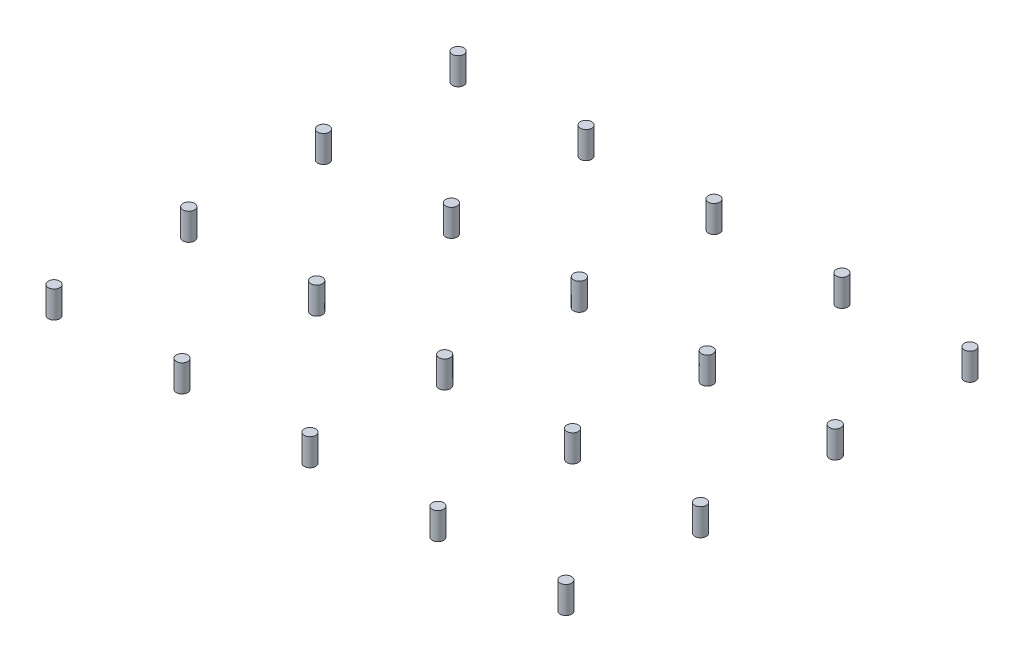
ISO-10303-21;
HEADER;
FILE_DESCRIPTION(('STEP AP214'),'2;1');
FILE_NAME('part.step','',(''),(''),'','','');
FILE_SCHEMA(('AUTOMOTIVE_DESIGN { 1 0 10303 214 1 1 1 1 }'));
ENDSEC;
DATA;
#1=APPLICATION_CONTEXT('core data for automotive mechanical design processes');
#2=APPLICATION_PROTOCOL_DEFINITION('international standard','automotive_design',2000,#1);
#3=PRODUCT_CONTEXT('',#1,'mechanical');
#4=PRODUCT('Part','Part','',(#3));
#5=PRODUCT_RELATED_PRODUCT_CATEGORY('part','',(#4));
#6=PRODUCT_DEFINITION_FORMATION('','',#4);
#7=PRODUCT_DEFINITION_CONTEXT('part definition',#1,'design');
#8=PRODUCT_DEFINITION('design','',#6,#7);
#9=PRODUCT_DEFINITION_SHAPE('','',#8);
#10=(LENGTH_UNIT() NAMED_UNIT(*) SI_UNIT(.MILLI.,.METRE.));
#11=(NAMED_UNIT(*) PLANE_ANGLE_UNIT() SI_UNIT($,.RADIAN.));
#12=(NAMED_UNIT(*) SI_UNIT($,.STERADIAN.) SOLID_ANGLE_UNIT());
#13=UNCERTAINTY_MEASURE_WITH_UNIT(LENGTH_MEASURE(1.E-05),#10,'distance_accuracy_value','');
#14=(GEOMETRIC_REPRESENTATION_CONTEXT(3) GLOBAL_UNCERTAINTY_ASSIGNED_CONTEXT((#13)) GLOBAL_UNIT_ASSIGNED_CONTEXT((#10,
#11,#12)) REPRESENTATION_CONTEXT('',''));
#15=CARTESIAN_POINT('',(0.,0.,0.));
#16=DIRECTION('',(0.,0.,1.));
#17=DIRECTION('',(1.,0.,0.));
#18=AXIS2_PLACEMENT_3D('',#15,#16,#17);
#19=CARTESIAN_POINT('',(-39.0000000000001,2.,-35.));
#20=DIRECTION('',(0.,-1.,0.));
#21=DIRECTION('',(0.,0.,-1.));
#22=AXIS2_PLACEMENT_3D('',#19,#20,#21);
#23=CYLINDRICAL_SURFACE('',#22,0.425000000000004);
#24=CARTESIAN_POINT('',(-39.0000000000001,2.,-35.));
#25=DIRECTION('',(0.,1.,0.));
#26=DIRECTION('',(0.,0.,1.));
#27=AXIS2_PLACEMENT_3D('',#24,#25,#26);
#28=CIRCLE('',#27,0.425000000000004);
#29=CARTESIAN_POINT('',(-39.0000000000001,2.,-34.575));
#30=VERTEX_POINT('',#29);
#31=EDGE_CURVE('E53',#30,#30,#28,.T.);
#32=ORIENTED_EDGE('',*,*,#31,.F.);
#33=EDGE_LOOP('',(#32));
#34=FACE_BOUND('',#33,.T.);
#35=CARTESIAN_POINT('',(-39.0000000000001,0.,-35.));
#36=DIRECTION('',(0.,1.,0.));
#37=DIRECTION('',(0.,0.,1.));
#38=AXIS2_PLACEMENT_3D('',#35,#36,#37);
#39=CIRCLE('',#38,0.425000000000004);
#40=CARTESIAN_POINT('',(-39.0000000000001,0.,-34.575));
#41=VERTEX_POINT('',#40);
#42=EDGE_CURVE('E11',#41,#41,#39,.T.);
#43=ORIENTED_EDGE('',*,*,#42,.T.);
#44=EDGE_LOOP('',(#43));
#45=FACE_BOUND('',#44,.T.);
#46=ADVANCED_FACE('F49',(#34,#45),#23,.T.);
#47=CARTESIAN_POINT('',(-39.0000000000001,2.,-35.));
#48=DIRECTION('',(0.,1.,0.));
#49=DIRECTION('',(0.,0.,1.));
#50=AXIS2_PLACEMENT_3D('',#47,#48,#49);
#51=PLANE('',#50);
#52=ORIENTED_EDGE('',*,*,#31,.T.);
#53=EDGE_LOOP('',(#52));
#54=FACE_BOUND('',#53,.T.);
#55=ADVANCED_FACE('F51',(#54),#51,.T.);
#56=CARTESIAN_POINT('',(-39.0000000000001,0.,-35.));
#57=DIRECTION('',(0.,1.,0.));
#58=DIRECTION('',(0.,0.,1.));
#59=AXIS2_PLACEMENT_3D('',#56,#57,#58);
#60=PLANE('',#59);
#61=ORIENTED_EDGE('',*,*,#42,.F.);
#62=EDGE_LOOP('',(#61));
#63=FACE_BOUND('',#62,.T.);
#64=ADVANCED_FACE('F68',(#63),#60,.F.);
#65=CLOSED_SHELL('',(#46,#55,#64));
#66=MANIFOLD_SOLID_BREP('B2',#65);
#67=CARTESIAN_POINT('',(-39.0000000000001,2.,-25.));
#68=DIRECTION('',(0.,-1.,0.));
#69=DIRECTION('',(0.,0.,-1.));
#70=AXIS2_PLACEMENT_3D('',#67,#68,#69);
#71=CYLINDRICAL_SURFACE('',#70,0.425000000000004);
#72=CARTESIAN_POINT('',(-39.0000000000001,2.,-25.));
#73=DIRECTION('',(0.,1.,0.));
#74=DIRECTION('',(0.,0.,1.));
#75=AXIS2_PLACEMENT_3D('',#72,#73,#74);
#76=CIRCLE('',#75,0.425000000000004);
#77=CARTESIAN_POINT('',(-39.0000000000001,2.,-24.575));
#78=VERTEX_POINT('',#77);
#79=EDGE_CURVE('E107',#78,#78,#76,.T.);
#80=ORIENTED_EDGE('',*,*,#79,.F.);
#81=EDGE_LOOP('',(#80));
#82=FACE_BOUND('',#81,.T.);
#83=CARTESIAN_POINT('',(-39.0000000000001,0.,-25.));
#84=DIRECTION('',(0.,1.,0.));
#85=DIRECTION('',(0.,0.,1.));
#86=AXIS2_PLACEMENT_3D('',#83,#84,#85);
#87=CIRCLE('',#86,0.425000000000004);
#88=CARTESIAN_POINT('',(-39.0000000000001,0.,-24.575));
#89=VERTEX_POINT('',#88);
#90=EDGE_CURVE('E48',#89,#89,#87,.T.);
#91=ORIENTED_EDGE('',*,*,#90,.T.);
#92=EDGE_LOOP('',(#91));
#93=FACE_BOUND('',#92,.T.);
#94=ADVANCED_FACE('F103',(#82,#93),#71,.T.);
#95=CARTESIAN_POINT('',(-39.0000000000001,2.,-25.));
#96=DIRECTION('',(0.,1.,0.));
#97=DIRECTION('',(0.,0.,1.));
#98=AXIS2_PLACEMENT_3D('',#95,#96,#97);
#99=PLANE('',#98);
#100=ORIENTED_EDGE('',*,*,#79,.T.);
#101=EDGE_LOOP('',(#100));
#102=FACE_BOUND('',#101,.T.);
#103=ADVANCED_FACE('F105',(#102),#99,.T.);
#104=CARTESIAN_POINT('',(-39.0000000000001,0.,-25.));
#105=DIRECTION('',(0.,1.,0.));
#106=DIRECTION('',(0.,0.,1.));
#107=AXIS2_PLACEMENT_3D('',#104,#105,#106);
#108=PLANE('',#107);
#109=ORIENTED_EDGE('',*,*,#90,.F.);
#110=EDGE_LOOP('',(#109));
#111=FACE_BOUND('',#110,.T.);
#112=ADVANCED_FACE('F122',(#111),#108,.F.);
#113=CLOSED_SHELL('',(#94,#103,#112));
#114=MANIFOLD_SOLID_BREP('B6',#113);
#115=CARTESIAN_POINT('',(-39.,2.,-15.));
#116=DIRECTION('',(0.,-1.,0.));
#117=DIRECTION('',(0.,0.,-1.));
#118=AXIS2_PLACEMENT_3D('',#115,#116,#117);
#119=CYLINDRICAL_SURFACE('',#118,0.425000000000003);
#120=CARTESIAN_POINT('',(-39.,2.,-15.));
#121=DIRECTION('',(0.,1.,0.));
#122=DIRECTION('',(0.,0.,1.));
#123=AXIS2_PLACEMENT_3D('',#120,#121,#122);
#124=CIRCLE('',#123,0.425000000000003);
#125=CARTESIAN_POINT('',(-39.,2.,-14.575));
#126=VERTEX_POINT('',#125);
#127=EDGE_CURVE('E161',#126,#126,#124,.T.);
#128=ORIENTED_EDGE('',*,*,#127,.F.);
#129=EDGE_LOOP('',(#128));
#130=FACE_BOUND('',#129,.T.);
#131=CARTESIAN_POINT('',(-39.,0.,-15.));
#132=DIRECTION('',(0.,1.,0.));
#133=DIRECTION('',(0.,0.,1.));
#134=AXIS2_PLACEMENT_3D('',#131,#132,#133);
#135=CIRCLE('',#134,0.425000000000003);
#136=CARTESIAN_POINT('',(-39.,0.,-14.575));
#137=VERTEX_POINT('',#136);
#138=EDGE_CURVE('E102',#137,#137,#135,.T.);
#139=ORIENTED_EDGE('',*,*,#138,.T.);
#140=EDGE_LOOP('',(#139));
#141=FACE_BOUND('',#140,.T.);
#142=ADVANCED_FACE('F157',(#130,#141),#119,.T.);
#143=CARTESIAN_POINT('',(-39.,2.,-15.));
#144=DIRECTION('',(0.,1.,0.));
#145=DIRECTION('',(0.,0.,1.));
#146=AXIS2_PLACEMENT_3D('',#143,#144,#145);
#147=PLANE('',#146);
#148=ORIENTED_EDGE('',*,*,#127,.T.);
#149=EDGE_LOOP('',(#148));
#150=FACE_BOUND('',#149,.T.);
#151=ADVANCED_FACE('F159',(#150),#147,.T.);
#152=CARTESIAN_POINT('',(-39.,0.,-15.));
#153=DIRECTION('',(0.,1.,0.));
#154=DIRECTION('',(0.,0.,1.));
#155=AXIS2_PLACEMENT_3D('',#152,#153,#154);
#156=PLANE('',#155);
#157=ORIENTED_EDGE('',*,*,#138,.F.);
#158=EDGE_LOOP('',(#157));
#159=FACE_BOUND('',#158,.T.);
#160=ADVANCED_FACE('F176',(#159),#156,.F.);
#161=CLOSED_SHELL('',(#142,#151,#160));
#162=MANIFOLD_SOLID_BREP('B43',#161);
#163=CARTESIAN_POINT('',(-1.00000000000011,2.,-35.));
#164=DIRECTION('',(0.,-1.,0.));
#165=DIRECTION('',(0.,0.,-1.));
#166=AXIS2_PLACEMENT_3D('',#163,#164,#165);
#167=CYLINDRICAL_SURFACE('',#166,0.425000000000004);
#168=CARTESIAN_POINT('',(-1.00000000000011,2.,-35.));
#169=DIRECTION('',(0.,1.,0.));
#170=DIRECTION('',(0.,0.,1.));
#171=AXIS2_PLACEMENT_3D('',#168,#169,#170);
#172=CIRCLE('',#171,0.425000000000004);
#173=CARTESIAN_POINT('',(-1.00000000000011,2.,-34.575));
#174=VERTEX_POINT('',#173);
#175=EDGE_CURVE('E215',#174,#174,#172,.T.);
#176=ORIENTED_EDGE('',*,*,#175,.F.);
#177=EDGE_LOOP('',(#176));
#178=FACE_BOUND('',#177,.T.);
#179=CARTESIAN_POINT('',(-1.00000000000011,0.,-35.));
#180=DIRECTION('',(0.,1.,0.));
#181=DIRECTION('',(0.,0.,1.));
#182=AXIS2_PLACEMENT_3D('',#179,#180,#181);
#183=CIRCLE('',#182,0.425000000000004);
#184=CARTESIAN_POINT('',(-1.00000000000011,0.,-34.575));
#185=VERTEX_POINT('',#184);
#186=EDGE_CURVE('E156',#185,#185,#183,.T.);
#187=ORIENTED_EDGE('',*,*,#186,.T.);
#188=EDGE_LOOP('',(#187));
#189=FACE_BOUND('',#188,.T.);
#190=ADVANCED_FACE('F211',(#178,#189),#167,.T.);
#191=CARTESIAN_POINT('',(-1.00000000000011,2.,-35.));
#192=DIRECTION('',(0.,1.,0.));
#193=DIRECTION('',(0.,0.,1.));
#194=AXIS2_PLACEMENT_3D('',#191,#192,#193);
#195=PLANE('',#194);
#196=ORIENTED_EDGE('',*,*,#175,.T.);
#197=EDGE_LOOP('',(#196));
#198=FACE_BOUND('',#197,.T.);
#199=ADVANCED_FACE('F213',(#198),#195,.T.);
#200=CARTESIAN_POINT('',(-1.00000000000011,0.,-35.));
#201=DIRECTION('',(0.,1.,0.));
#202=DIRECTION('',(0.,0.,1.));
#203=AXIS2_PLACEMENT_3D('',#200,#201,#202);
#204=PLANE('',#203);
#205=ORIENTED_EDGE('',*,*,#186,.F.);
#206=EDGE_LOOP('',(#205));
#207=FACE_BOUND('',#206,.T.);
#208=ADVANCED_FACE('F230',(#207),#204,.F.);
#209=CLOSED_SHELL('',(#190,#199,#208));
#210=MANIFOLD_SOLID_BREP('B97',#209);
#211=CARTESIAN_POINT('',(-10.5000000000001,2.,-35.));
#212=DIRECTION('',(0.,-1.,0.));
#213=DIRECTION('',(0.,0.,-1.));
#214=AXIS2_PLACEMENT_3D('',#211,#212,#213);
#215=CYLINDRICAL_SURFACE('',#214,0.425000000000004);
#216=CARTESIAN_POINT('',(-10.5000000000001,2.,-35.));
#217=DIRECTION('',(0.,1.,0.));
#218=DIRECTION('',(0.,0.,1.));
#219=AXIS2_PLACEMENT_3D('',#216,#217,#218);
#220=CIRCLE('',#219,0.425000000000004);
#221=CARTESIAN_POINT('',(-10.5000000000001,2.,-34.575));
#222=VERTEX_POINT('',#221);
#223=EDGE_CURVE('E269',#222,#222,#220,.T.);
#224=ORIENTED_EDGE('',*,*,#223,.F.);
#225=EDGE_LOOP('',(#224));
#226=FACE_BOUND('',#225,.T.);
#227=CARTESIAN_POINT('',(-10.5000000000001,0.,-35.));
#228=DIRECTION('',(0.,1.,0.));
#229=DIRECTION('',(0.,0.,1.));
#230=AXIS2_PLACEMENT_3D('',#227,#228,#229);
#231=CIRCLE('',#230,0.425000000000004);
#232=CARTESIAN_POINT('',(-10.5000000000001,0.,-34.575));
#233=VERTEX_POINT('',#232);
#234=EDGE_CURVE('E210',#233,#233,#231,.T.);
#235=ORIENTED_EDGE('',*,*,#234,.T.);
#236=EDGE_LOOP('',(#235));
#237=FACE_BOUND('',#236,.T.);
#238=ADVANCED_FACE('F265',(#226,#237),#215,.T.);
#239=CARTESIAN_POINT('',(-10.5000000000001,2.,-35.));
#240=DIRECTION('',(0.,1.,0.));
#241=DIRECTION('',(0.,0.,1.));
#242=AXIS2_PLACEMENT_3D('',#239,#240,#241);
#243=PLANE('',#242);
#244=ORIENTED_EDGE('',*,*,#223,.T.);
#245=EDGE_LOOP('',(#244));
#246=FACE_BOUND('',#245,.T.);
#247=ADVANCED_FACE('F267',(#246),#243,.T.);
#248=CARTESIAN_POINT('',(-10.5000000000001,0.,-35.));
#249=DIRECTION('',(0.,1.,0.));
#250=DIRECTION('',(0.,0.,1.));
#251=AXIS2_PLACEMENT_3D('',#248,#249,#250);
#252=PLANE('',#251);
#253=ORIENTED_EDGE('',*,*,#234,.F.);
#254=EDGE_LOOP('',(#253));
#255=FACE_BOUND('',#254,.T.);
#256=ADVANCED_FACE('F284',(#255),#252,.F.);
#257=CLOSED_SHELL('',(#238,#247,#256));
#258=MANIFOLD_SOLID_BREP('B151',#257);
#259=CARTESIAN_POINT('',(-20.0000000000001,2.,-35.));
#260=DIRECTION('',(0.,-1.,0.));
#261=DIRECTION('',(0.,0.,-1.));
#262=AXIS2_PLACEMENT_3D('',#259,#260,#261);
#263=CYLINDRICAL_SURFACE('',#262,0.425000000000004);
#264=CARTESIAN_POINT('',(-20.0000000000001,2.,-35.));
#265=DIRECTION('',(0.,1.,0.));
#266=DIRECTION('',(0.,0.,1.));
#267=AXIS2_PLACEMENT_3D('',#264,#265,#266);
#268=CIRCLE('',#267,0.425000000000004);
#269=CARTESIAN_POINT('',(-20.0000000000001,2.,-34.575));
#270=VERTEX_POINT('',#269);
#271=EDGE_CURVE('E323',#270,#270,#268,.T.);
#272=ORIENTED_EDGE('',*,*,#271,.F.);
#273=EDGE_LOOP('',(#272));
#274=FACE_BOUND('',#273,.T.);
#275=CARTESIAN_POINT('',(-20.0000000000001,0.,-35.));
#276=DIRECTION('',(0.,1.,0.));
#277=DIRECTION('',(0.,0.,1.));
#278=AXIS2_PLACEMENT_3D('',#275,#276,#277);
#279=CIRCLE('',#278,0.425000000000004);
#280=CARTESIAN_POINT('',(-20.0000000000001,0.,-34.575));
#281=VERTEX_POINT('',#280);
#282=EDGE_CURVE('E264',#281,#281,#279,.T.);
#283=ORIENTED_EDGE('',*,*,#282,.T.);
#284=EDGE_LOOP('',(#283));
#285=FACE_BOUND('',#284,.T.);
#286=ADVANCED_FACE('F319',(#274,#285),#263,.T.);
#287=CARTESIAN_POINT('',(-20.0000000000001,2.,-35.));
#288=DIRECTION('',(0.,1.,0.));
#289=DIRECTION('',(0.,0.,1.));
#290=AXIS2_PLACEMENT_3D('',#287,#288,#289);
#291=PLANE('',#290);
#292=ORIENTED_EDGE('',*,*,#271,.T.);
#293=EDGE_LOOP('',(#292));
#294=FACE_BOUND('',#293,.T.);
#295=ADVANCED_FACE('F321',(#294),#291,.T.);
#296=CARTESIAN_POINT('',(-20.0000000000001,0.,-35.));
#297=DIRECTION('',(0.,1.,0.));
#298=DIRECTION('',(0.,0.,1.));
#299=AXIS2_PLACEMENT_3D('',#296,#297,#298);
#300=PLANE('',#299);
#301=ORIENTED_EDGE('',*,*,#282,.F.);
#302=EDGE_LOOP('',(#301));
#303=FACE_BOUND('',#302,.T.);
#304=ADVANCED_FACE('F338',(#303),#300,.F.);
#305=CLOSED_SHELL('',(#286,#295,#304));
#306=MANIFOLD_SOLID_BREP('B205',#305);
#307=CARTESIAN_POINT('',(-29.5000000000001,2.,-35.));
#308=DIRECTION('',(0.,-1.,0.));
#309=DIRECTION('',(0.,0.,-1.));
#310=AXIS2_PLACEMENT_3D('',#307,#308,#309);
#311=CYLINDRICAL_SURFACE('',#310,0.425000000000004);
#312=CARTESIAN_POINT('',(-29.5000000000001,2.,-35.));
#313=DIRECTION('',(0.,1.,0.));
#314=DIRECTION('',(0.,0.,1.));
#315=AXIS2_PLACEMENT_3D('',#312,#313,#314);
#316=CIRCLE('',#315,0.425000000000004);
#317=CARTESIAN_POINT('',(-29.5000000000001,2.,-34.575));
#318=VERTEX_POINT('',#317);
#319=EDGE_CURVE('E378',#318,#318,#316,.T.);
#320=ORIENTED_EDGE('',*,*,#319,.F.);
#321=EDGE_LOOP('',(#320));
#322=FACE_BOUND('',#321,.T.);
#323=CARTESIAN_POINT('',(-29.5000000000001,0.,-35.));
#324=DIRECTION('',(0.,1.,0.));
#325=DIRECTION('',(0.,0.,1.));
#326=AXIS2_PLACEMENT_3D('',#323,#324,#325);
#327=CIRCLE('',#326,0.425000000000004);
#328=CARTESIAN_POINT('',(-29.5000000000001,0.,-34.575));
#329=VERTEX_POINT('',#328);
#330=EDGE_CURVE('E318',#329,#329,#327,.T.);
#331=ORIENTED_EDGE('',*,*,#330,.T.);
#332=EDGE_LOOP('',(#331));
#333=FACE_BOUND('',#332,.T.);
#334=ADVANCED_FACE('F374',(#322,#333),#311,.T.);
#335=CARTESIAN_POINT('',(-29.5000000000001,2.,-35.));
#336=DIRECTION('',(0.,1.,0.));
#337=DIRECTION('',(0.,0.,1.));
#338=AXIS2_PLACEMENT_3D('',#335,#336,#337);
#339=PLANE('',#338);
#340=ORIENTED_EDGE('',*,*,#319,.T.);
#341=EDGE_LOOP('',(#340));
#342=FACE_BOUND('',#341,.T.);
#343=ADVANCED_FACE('F376',(#342),#339,.T.);
#344=CARTESIAN_POINT('',(-29.5000000000001,0.,-35.));
#345=DIRECTION('',(0.,1.,0.));
#346=DIRECTION('',(0.,0.,1.));
#347=AXIS2_PLACEMENT_3D('',#344,#345,#346);
#348=PLANE('',#347);
#349=ORIENTED_EDGE('',*,*,#330,.F.);
#350=EDGE_LOOP('',(#349));
#351=FACE_BOUND('',#350,.T.);
#352=ADVANCED_FACE('F395',(#351),#348,.F.);
#353=CLOSED_SHELL('',(#334,#343,#352));
#354=MANIFOLD_SOLID_BREP('B259',#353);
#355=CARTESIAN_POINT('',(-1.00000000000007,2.,-25.));
#356=DIRECTION('',(0.,-1.,0.));
#357=DIRECTION('',(0.,0.,-1.));
#358=AXIS2_PLACEMENT_3D('',#355,#356,#357);
#359=CYLINDRICAL_SURFACE('',#358,0.425000000000004);
#360=CARTESIAN_POINT('',(-1.00000000000007,2.,-25.));
#361=DIRECTION('',(0.,1.,0.));
#362=DIRECTION('',(0.,0.,1.));
#363=AXIS2_PLACEMENT_3D('',#360,#361,#362);
#364=CIRCLE('',#363,0.425000000000004);
#365=CARTESIAN_POINT('',(-1.00000000000007,2.,-24.575));
#366=VERTEX_POINT('',#365);
#367=EDGE_CURVE('E434',#366,#366,#364,.T.);
#368=ORIENTED_EDGE('',*,*,#367,.F.);
#369=EDGE_LOOP('',(#368));
#370=FACE_BOUND('',#369,.T.);
#371=CARTESIAN_POINT('',(-1.00000000000007,0.,-25.));
#372=DIRECTION('',(0.,1.,0.));
#373=DIRECTION('',(0.,0.,1.));
#374=AXIS2_PLACEMENT_3D('',#371,#372,#373);
#375=CIRCLE('',#374,0.425000000000004);
#376=CARTESIAN_POINT('',(-1.00000000000007,0.,-24.575));
#377=VERTEX_POINT('',#376);
#378=EDGE_CURVE('E373',#377,#377,#375,.T.);
#379=ORIENTED_EDGE('',*,*,#378,.T.);
#380=EDGE_LOOP('',(#379));
#381=FACE_BOUND('',#380,.T.);
#382=ADVANCED_FACE('F430',(#370,#381),#359,.T.);
#383=CARTESIAN_POINT('',(-1.00000000000007,2.,-25.));
#384=DIRECTION('',(0.,1.,0.));
#385=DIRECTION('',(0.,0.,1.));
#386=AXIS2_PLACEMENT_3D('',#383,#384,#385);
#387=PLANE('',#386);
#388=ORIENTED_EDGE('',*,*,#367,.T.);
#389=EDGE_LOOP('',(#388));
#390=FACE_BOUND('',#389,.T.);
#391=ADVANCED_FACE('F432',(#390),#387,.T.);
#392=CARTESIAN_POINT('',(-1.00000000000007,0.,-25.));
#393=DIRECTION('',(0.,1.,0.));
#394=DIRECTION('',(0.,0.,1.));
#395=AXIS2_PLACEMENT_3D('',#392,#393,#394);
#396=PLANE('',#395);
#397=ORIENTED_EDGE('',*,*,#378,.F.);
#398=EDGE_LOOP('',(#397));
#399=FACE_BOUND('',#398,.T.);
#400=ADVANCED_FACE('F449',(#399),#396,.F.);
#401=CLOSED_SHELL('',(#382,#391,#400));
#402=MANIFOLD_SOLID_BREP('B313',#401);
#403=CARTESIAN_POINT('',(-10.5000000000001,2.,-25.));
#404=DIRECTION('',(0.,-1.,0.));
#405=DIRECTION('',(0.,0.,-1.));
#406=AXIS2_PLACEMENT_3D('',#403,#404,#405);
#407=CYLINDRICAL_SURFACE('',#406,0.425000000000004);
#408=CARTESIAN_POINT('',(-10.5000000000001,2.,-25.));
#409=DIRECTION('',(0.,1.,0.));
#410=DIRECTION('',(0.,0.,1.));
#411=AXIS2_PLACEMENT_3D('',#408,#409,#410);
#412=CIRCLE('',#411,0.425000000000004);
#413=CARTESIAN_POINT('',(-10.5000000000001,2.,-24.575));
#414=VERTEX_POINT('',#413);
#415=EDGE_CURVE('E488',#414,#414,#412,.T.);
#416=ORIENTED_EDGE('',*,*,#415,.F.);
#417=EDGE_LOOP('',(#416));
#418=FACE_BOUND('',#417,.T.);
#419=CARTESIAN_POINT('',(-10.5000000000001,0.,-25.));
#420=DIRECTION('',(0.,1.,0.));
#421=DIRECTION('',(0.,0.,1.));
#422=AXIS2_PLACEMENT_3D('',#419,#420,#421);
#423=CIRCLE('',#422,0.425000000000004);
#424=CARTESIAN_POINT('',(-10.5000000000001,0.,-24.575));
#425=VERTEX_POINT('',#424);
#426=EDGE_CURVE('E429',#425,#425,#423,.T.);
#427=ORIENTED_EDGE('',*,*,#426,.T.);
#428=EDGE_LOOP('',(#427));
#429=FACE_BOUND('',#428,.T.);
#430=ADVANCED_FACE('F484',(#418,#429),#407,.T.);
#431=CARTESIAN_POINT('',(-10.5000000000001,2.,-25.));
#432=DIRECTION('',(0.,1.,0.));
#433=DIRECTION('',(0.,0.,1.));
#434=AXIS2_PLACEMENT_3D('',#431,#432,#433);
#435=PLANE('',#434);
#436=ORIENTED_EDGE('',*,*,#415,.T.);
#437=EDGE_LOOP('',(#436));
#438=FACE_BOUND('',#437,.T.);
#439=ADVANCED_FACE('F486',(#438),#435,.T.);
#440=CARTESIAN_POINT('',(-10.5000000000001,0.,-25.));
#441=DIRECTION('',(0.,1.,0.));
#442=DIRECTION('',(0.,0.,1.));
#443=AXIS2_PLACEMENT_3D('',#440,#441,#442);
#444=PLANE('',#443);
#445=ORIENTED_EDGE('',*,*,#426,.F.);
#446=EDGE_LOOP('',(#445));
#447=FACE_BOUND('',#446,.T.);
#448=ADVANCED_FACE('F503',(#447),#444,.F.);
#449=CLOSED_SHELL('',(#430,#439,#448));
#450=MANIFOLD_SOLID_BREP('B368',#449);
#451=CARTESIAN_POINT('',(-20.0000000000001,2.,-25.));
#452=DIRECTION('',(0.,-1.,0.));
#453=DIRECTION('',(0.,0.,-1.));
#454=AXIS2_PLACEMENT_3D('',#451,#452,#453);
#455=CYLINDRICAL_SURFACE('',#454,0.425000000000004);
#456=CARTESIAN_POINT('',(-20.0000000000001,2.,-25.));
#457=DIRECTION('',(0.,1.,0.));
#458=DIRECTION('',(0.,0.,1.));
#459=AXIS2_PLACEMENT_3D('',#456,#457,#458);
#460=CIRCLE('',#459,0.425000000000004);
#461=CARTESIAN_POINT('',(-20.0000000000001,2.,-24.575));
#462=VERTEX_POINT('',#461);
#463=EDGE_CURVE('E542',#462,#462,#460,.T.);
#464=ORIENTED_EDGE('',*,*,#463,.F.);
#465=EDGE_LOOP('',(#464));
#466=FACE_BOUND('',#465,.T.);
#467=CARTESIAN_POINT('',(-20.0000000000001,0.,-25.));
#468=DIRECTION('',(0.,1.,0.));
#469=DIRECTION('',(0.,0.,1.));
#470=AXIS2_PLACEMENT_3D('',#467,#468,#469);
#471=CIRCLE('',#470,0.425000000000004);
#472=CARTESIAN_POINT('',(-20.0000000000001,0.,-24.575));
#473=VERTEX_POINT('',#472);
#474=EDGE_CURVE('E483',#473,#473,#471,.T.);
#475=ORIENTED_EDGE('',*,*,#474,.T.);
#476=EDGE_LOOP('',(#475));
#477=FACE_BOUND('',#476,.T.);
#478=ADVANCED_FACE('F538',(#466,#477),#455,.T.);
#479=CARTESIAN_POINT('',(-20.0000000000001,2.,-25.));
#480=DIRECTION('',(0.,1.,0.));
#481=DIRECTION('',(0.,0.,1.));
#482=AXIS2_PLACEMENT_3D('',#479,#480,#481);
#483=PLANE('',#482);
#484=ORIENTED_EDGE('',*,*,#463,.T.);
#485=EDGE_LOOP('',(#484));
#486=FACE_BOUND('',#485,.T.);
#487=ADVANCED_FACE('F540',(#486),#483,.T.);
#488=CARTESIAN_POINT('',(-20.0000000000001,0.,-25.));
#489=DIRECTION('',(0.,1.,0.));
#490=DIRECTION('',(0.,0.,1.));
#491=AXIS2_PLACEMENT_3D('',#488,#489,#490);
#492=PLANE('',#491);
#493=ORIENTED_EDGE('',*,*,#474,.F.);
#494=EDGE_LOOP('',(#493));
#495=FACE_BOUND('',#494,.T.);
#496=ADVANCED_FACE('F557',(#495),#492,.F.);
#497=CLOSED_SHELL('',(#478,#487,#496));
#498=MANIFOLD_SOLID_BREP('B424',#497);
#499=CARTESIAN_POINT('',(-29.5000000000001,2.,-25.));
#500=DIRECTION('',(0.,-1.,0.));
#501=DIRECTION('',(0.,0.,-1.));
#502=AXIS2_PLACEMENT_3D('',#499,#500,#501);
#503=CYLINDRICAL_SURFACE('',#502,0.425000000000004);
#504=CARTESIAN_POINT('',(-29.5000000000001,2.,-25.));
#505=DIRECTION('',(0.,1.,0.));
#506=DIRECTION('',(0.,0.,1.));
#507=AXIS2_PLACEMENT_3D('',#504,#505,#506);
#508=CIRCLE('',#507,0.425000000000004);
#509=CARTESIAN_POINT('',(-29.5000000000001,2.,-24.575));
#510=VERTEX_POINT('',#509);
#511=EDGE_CURVE('E596',#510,#510,#508,.T.);
#512=ORIENTED_EDGE('',*,*,#511,.F.);
#513=EDGE_LOOP('',(#512));
#514=FACE_BOUND('',#513,.T.);
#515=CARTESIAN_POINT('',(-29.5000000000001,0.,-25.));
#516=DIRECTION('',(0.,1.,0.));
#517=DIRECTION('',(0.,0.,1.));
#518=AXIS2_PLACEMENT_3D('',#515,#516,#517);
#519=CIRCLE('',#518,0.425000000000004);
#520=CARTESIAN_POINT('',(-29.5000000000001,0.,-24.575));
#521=VERTEX_POINT('',#520);
#522=EDGE_CURVE('E537',#521,#521,#519,.T.);
#523=ORIENTED_EDGE('',*,*,#522,.T.);
#524=EDGE_LOOP('',(#523));
#525=FACE_BOUND('',#524,.T.);
#526=ADVANCED_FACE('F592',(#514,#525),#503,.T.);
#527=CARTESIAN_POINT('',(-29.5000000000001,2.,-25.));
#528=DIRECTION('',(0.,1.,0.));
#529=DIRECTION('',(0.,0.,1.));
#530=AXIS2_PLACEMENT_3D('',#527,#528,#529);
#531=PLANE('',#530);
#532=ORIENTED_EDGE('',*,*,#511,.T.);
#533=EDGE_LOOP('',(#532));
#534=FACE_BOUND('',#533,.T.);
#535=ADVANCED_FACE('F594',(#534),#531,.T.);
#536=CARTESIAN_POINT('',(-29.5000000000001,0.,-25.));
#537=DIRECTION('',(0.,1.,0.));
#538=DIRECTION('',(0.,0.,1.));
#539=AXIS2_PLACEMENT_3D('',#536,#537,#538);
#540=PLANE('',#539);
#541=ORIENTED_EDGE('',*,*,#522,.F.);
#542=EDGE_LOOP('',(#541));
#543=FACE_BOUND('',#542,.T.);
#544=ADVANCED_FACE('F611',(#543),#540,.F.);
#545=CLOSED_SHELL('',(#526,#535,#544));
#546=MANIFOLD_SOLID_BREP('B478',#545);
#547=CARTESIAN_POINT('',(-1.00000000000004,2.,-15.));
#548=DIRECTION('',(0.,-1.,0.));
#549=DIRECTION('',(0.,0.,-1.));
#550=AXIS2_PLACEMENT_3D('',#547,#548,#549);
#551=CYLINDRICAL_SURFACE('',#550,0.425000000000003);
#552=CARTESIAN_POINT('',(-1.00000000000004,2.,-15.));
#553=DIRECTION('',(0.,1.,0.));
#554=DIRECTION('',(0.,0.,1.));
#555=AXIS2_PLACEMENT_3D('',#552,#553,#554);
#556=CIRCLE('',#555,0.425000000000003);
#557=CARTESIAN_POINT('',(-1.00000000000004,2.,-14.575));
#558=VERTEX_POINT('',#557);
#559=EDGE_CURVE('E650',#558,#558,#556,.T.);
#560=ORIENTED_EDGE('',*,*,#559,.F.);
#561=EDGE_LOOP('',(#560));
#562=FACE_BOUND('',#561,.T.);
#563=CARTESIAN_POINT('',(-1.00000000000004,0.,-15.));
#564=DIRECTION('',(0.,1.,0.));
#565=DIRECTION('',(0.,0.,1.));
#566=AXIS2_PLACEMENT_3D('',#563,#564,#565);
#567=CIRCLE('',#566,0.425000000000003);
#568=CARTESIAN_POINT('',(-1.00000000000004,0.,-14.575));
#569=VERTEX_POINT('',#568);
#570=EDGE_CURVE('E591',#569,#569,#567,.T.);
#571=ORIENTED_EDGE('',*,*,#570,.T.);
#572=EDGE_LOOP('',(#571));
#573=FACE_BOUND('',#572,.T.);
#574=ADVANCED_FACE('F646',(#562,#573),#551,.T.);
#575=CARTESIAN_POINT('',(-1.00000000000004,2.,-15.));
#576=DIRECTION('',(0.,1.,0.));
#577=DIRECTION('',(0.,0.,1.));
#578=AXIS2_PLACEMENT_3D('',#575,#576,#577);
#579=PLANE('',#578);
#580=ORIENTED_EDGE('',*,*,#559,.T.);
#581=EDGE_LOOP('',(#580));
#582=FACE_BOUND('',#581,.T.);
#583=ADVANCED_FACE('F648',(#582),#579,.T.);
#584=CARTESIAN_POINT('',(-1.00000000000004,0.,-15.));
#585=DIRECTION('',(0.,1.,0.));
#586=DIRECTION('',(0.,0.,1.));
#587=AXIS2_PLACEMENT_3D('',#584,#585,#586);
#588=PLANE('',#587);
#589=ORIENTED_EDGE('',*,*,#570,.F.);
#590=EDGE_LOOP('',(#589));
#591=FACE_BOUND('',#590,.T.);
#592=ADVANCED_FACE('F665',(#591),#588,.F.);
#593=CLOSED_SHELL('',(#574,#583,#592));
#594=MANIFOLD_SOLID_BREP('B532',#593);
#595=CARTESIAN_POINT('',(-10.5,2.,-15.));
#596=DIRECTION('',(0.,-1.,0.));
#597=DIRECTION('',(0.,0.,-1.));
#598=AXIS2_PLACEMENT_3D('',#595,#596,#597);
#599=CYLINDRICAL_SURFACE('',#598,0.425000000000003);
#600=CARTESIAN_POINT('',(-10.5,2.,-15.));
#601=DIRECTION('',(0.,1.,0.));
#602=DIRECTION('',(0.,0.,1.));
#603=AXIS2_PLACEMENT_3D('',#600,#601,#602);
#604=CIRCLE('',#603,0.425000000000003);
#605=CARTESIAN_POINT('',(-10.5,2.,-14.575));
#606=VERTEX_POINT('',#605);
#607=EDGE_CURVE('E704',#606,#606,#604,.T.);
#608=ORIENTED_EDGE('',*,*,#607,.F.);
#609=EDGE_LOOP('',(#608));
#610=FACE_BOUND('',#609,.T.);
#611=CARTESIAN_POINT('',(-10.5,0.,-15.));
#612=DIRECTION('',(0.,1.,0.));
#613=DIRECTION('',(0.,0.,1.));
#614=AXIS2_PLACEMENT_3D('',#611,#612,#613);
#615=CIRCLE('',#614,0.425000000000003);
#616=CARTESIAN_POINT('',(-10.5,0.,-14.575));
#617=VERTEX_POINT('',#616);
#618=EDGE_CURVE('E645',#617,#617,#615,.T.);
#619=ORIENTED_EDGE('',*,*,#618,.T.);
#620=EDGE_LOOP('',(#619));
#621=FACE_BOUND('',#620,.T.);
#622=ADVANCED_FACE('F700',(#610,#621),#599,.T.);
#623=CARTESIAN_POINT('',(-10.5,2.,-15.));
#624=DIRECTION('',(0.,1.,0.));
#625=DIRECTION('',(0.,0.,1.));
#626=AXIS2_PLACEMENT_3D('',#623,#624,#625);
#627=PLANE('',#626);
#628=ORIENTED_EDGE('',*,*,#607,.T.);
#629=EDGE_LOOP('',(#628));
#630=FACE_BOUND('',#629,.T.);
#631=ADVANCED_FACE('F702',(#630),#627,.T.);
#632=CARTESIAN_POINT('',(-10.5,0.,-15.));
#633=DIRECTION('',(0.,1.,0.));
#634=DIRECTION('',(0.,0.,1.));
#635=AXIS2_PLACEMENT_3D('',#632,#633,#634);
#636=PLANE('',#635);
#637=ORIENTED_EDGE('',*,*,#618,.F.);
#638=EDGE_LOOP('',(#637));
#639=FACE_BOUND('',#638,.T.);
#640=ADVANCED_FACE('F719',(#639),#636,.F.);
#641=CLOSED_SHELL('',(#622,#631,#640));
#642=MANIFOLD_SOLID_BREP('B586',#641);
#643=CARTESIAN_POINT('',(-20.,2.,-15.));
#644=DIRECTION('',(0.,-1.,0.));
#645=DIRECTION('',(0.,0.,-1.));
#646=AXIS2_PLACEMENT_3D('',#643,#644,#645);
#647=CYLINDRICAL_SURFACE('',#646,0.425000000000003);
#648=CARTESIAN_POINT('',(-20.,2.,-15.));
#649=DIRECTION('',(0.,1.,0.));
#650=DIRECTION('',(0.,0.,1.));
#651=AXIS2_PLACEMENT_3D('',#648,#649,#650);
#652=CIRCLE('',#651,0.425000000000003);
#653=CARTESIAN_POINT('',(-20.,2.,-14.575));
#654=VERTEX_POINT('',#653);
#655=EDGE_CURVE('E758',#654,#654,#652,.T.);
#656=ORIENTED_EDGE('',*,*,#655,.F.);
#657=EDGE_LOOP('',(#656));
#658=FACE_BOUND('',#657,.T.);
#659=CARTESIAN_POINT('',(-20.,0.,-15.));
#660=DIRECTION('',(0.,1.,0.));
#661=DIRECTION('',(0.,0.,1.));
#662=AXIS2_PLACEMENT_3D('',#659,#660,#661);
#663=CIRCLE('',#662,0.425000000000003);
#664=CARTESIAN_POINT('',(-20.,0.,-14.575));
#665=VERTEX_POINT('',#664);
#666=EDGE_CURVE('E699',#665,#665,#663,.T.);
#667=ORIENTED_EDGE('',*,*,#666,.T.);
#668=EDGE_LOOP('',(#667));
#669=FACE_BOUND('',#668,.T.);
#670=ADVANCED_FACE('F754',(#658,#669),#647,.T.);
#671=CARTESIAN_POINT('',(-20.,2.,-15.));
#672=DIRECTION('',(0.,1.,0.));
#673=DIRECTION('',(0.,0.,1.));
#674=AXIS2_PLACEMENT_3D('',#671,#672,#673);
#675=PLANE('',#674);
#676=ORIENTED_EDGE('',*,*,#655,.T.);
#677=EDGE_LOOP('',(#676));
#678=FACE_BOUND('',#677,.T.);
#679=ADVANCED_FACE('F756',(#678),#675,.T.);
#680=CARTESIAN_POINT('',(-20.,0.,-15.));
#681=DIRECTION('',(0.,1.,0.));
#682=DIRECTION('',(0.,0.,1.));
#683=AXIS2_PLACEMENT_3D('',#680,#681,#682);
#684=PLANE('',#683);
#685=ORIENTED_EDGE('',*,*,#666,.F.);
#686=EDGE_LOOP('',(#685));
#687=FACE_BOUND('',#686,.T.);
#688=ADVANCED_FACE('F773',(#687),#684,.F.);
#689=CLOSED_SHELL('',(#670,#679,#688));
#690=MANIFOLD_SOLID_BREP('B640',#689);
#691=CARTESIAN_POINT('',(-29.5,2.,-15.));
#692=DIRECTION('',(0.,-1.,0.));
#693=DIRECTION('',(0.,0.,-1.));
#694=AXIS2_PLACEMENT_3D('',#691,#692,#693);
#695=CYLINDRICAL_SURFACE('',#694,0.425000000000003);
#696=CARTESIAN_POINT('',(-29.5,2.,-15.));
#697=DIRECTION('',(0.,1.,0.));
#698=DIRECTION('',(0.,0.,1.));
#699=AXIS2_PLACEMENT_3D('',#696,#697,#698);
#700=CIRCLE('',#699,0.425000000000003);
#701=CARTESIAN_POINT('',(-29.5,2.,-14.575));
#702=VERTEX_POINT('',#701);
#703=EDGE_CURVE('E812',#702,#702,#700,.T.);
#704=ORIENTED_EDGE('',*,*,#703,.F.);
#705=EDGE_LOOP('',(#704));
#706=FACE_BOUND('',#705,.T.);
#707=CARTESIAN_POINT('',(-29.5,0.,-15.));
#708=DIRECTION('',(0.,1.,0.));
#709=DIRECTION('',(0.,0.,1.));
#710=AXIS2_PLACEMENT_3D('',#707,#708,#709);
#711=CIRCLE('',#710,0.425000000000003);
#712=CARTESIAN_POINT('',(-29.5,0.,-14.575));
#713=VERTEX_POINT('',#712);
#714=EDGE_CURVE('E753',#713,#713,#711,.T.);
#715=ORIENTED_EDGE('',*,*,#714,.T.);
#716=EDGE_LOOP('',(#715));
#717=FACE_BOUND('',#716,.T.);
#718=ADVANCED_FACE('F808',(#706,#717),#695,.T.);
#719=CARTESIAN_POINT('',(-29.5,2.,-15.));
#720=DIRECTION('',(0.,1.,0.));
#721=DIRECTION('',(0.,0.,1.));
#722=AXIS2_PLACEMENT_3D('',#719,#720,#721);
#723=PLANE('',#722);
#724=ORIENTED_EDGE('',*,*,#703,.T.);
#725=EDGE_LOOP('',(#724));
#726=FACE_BOUND('',#725,.T.);
#727=ADVANCED_FACE('F810',(#726),#723,.T.);
#728=CARTESIAN_POINT('',(-29.5,0.,-15.));
#729=DIRECTION('',(0.,1.,0.));
#730=DIRECTION('',(0.,0.,1.));
#731=AXIS2_PLACEMENT_3D('',#728,#729,#730);
#732=PLANE('',#731);
#733=ORIENTED_EDGE('',*,*,#714,.F.);
#734=EDGE_LOOP('',(#733));
#735=FACE_BOUND('',#734,.T.);
#736=ADVANCED_FACE('F827',(#735),#732,.F.);
#737=CLOSED_SHELL('',(#718,#727,#736));
#738=MANIFOLD_SOLID_BREP('B694',#737);
#739=CARTESIAN_POINT('',(-1.,2.,-4.99999999999999));
#740=DIRECTION('',(0.,-1.,0.));
#741=DIRECTION('',(0.,0.,-1.));
#742=AXIS2_PLACEMENT_3D('',#739,#740,#741);
#743=CYLINDRICAL_SURFACE('',#742,0.425000000000003);
#744=CARTESIAN_POINT('',(-1.,2.,-4.99999999999999));
#745=DIRECTION('',(0.,1.,0.));
#746=DIRECTION('',(0.,0.,1.));
#747=AXIS2_PLACEMENT_3D('',#744,#745,#746);
#748=CIRCLE('',#747,0.425000000000003);
#749=CARTESIAN_POINT('',(-1.,2.,-4.57499999999999));
#750=VERTEX_POINT('',#749);
#751=EDGE_CURVE('E866',#750,#750,#748,.T.);
#752=ORIENTED_EDGE('',*,*,#751,.F.);
#753=EDGE_LOOP('',(#752));
#754=FACE_BOUND('',#753,.T.);
#755=CARTESIAN_POINT('',(-1.,0.,-4.99999999999999));
#756=DIRECTION('',(0.,1.,0.));
#757=DIRECTION('',(0.,0.,1.));
#758=AXIS2_PLACEMENT_3D('',#755,#756,#757);
#759=CIRCLE('',#758,0.425000000000003);
#760=CARTESIAN_POINT('',(-1.,0.,-4.57499999999999));
#761=VERTEX_POINT('',#760);
#762=EDGE_CURVE('E807',#761,#761,#759,.T.);
#763=ORIENTED_EDGE('',*,*,#762,.T.);
#764=EDGE_LOOP('',(#763));
#765=FACE_BOUND('',#764,.T.);
#766=ADVANCED_FACE('F862',(#754,#765),#743,.T.);
#767=CARTESIAN_POINT('',(-1.,2.,-4.99999999999999));
#768=DIRECTION('',(0.,1.,0.));
#769=DIRECTION('',(0.,0.,1.));
#770=AXIS2_PLACEMENT_3D('',#767,#768,#769);
#771=PLANE('',#770);
#772=ORIENTED_EDGE('',*,*,#751,.T.);
#773=EDGE_LOOP('',(#772));
#774=FACE_BOUND('',#773,.T.);
#775=ADVANCED_FACE('F864',(#774),#771,.T.);
#776=CARTESIAN_POINT('',(-1.,0.,-4.99999999999999));
#777=DIRECTION('',(0.,1.,0.));
#778=DIRECTION('',(0.,0.,1.));
#779=AXIS2_PLACEMENT_3D('',#776,#777,#778);
#780=PLANE('',#779);
#781=ORIENTED_EDGE('',*,*,#762,.F.);
#782=EDGE_LOOP('',(#781));
#783=FACE_BOUND('',#782,.T.);
#784=ADVANCED_FACE('F881',(#783),#780,.F.);
#785=CLOSED_SHELL('',(#766,#775,#784));
#786=MANIFOLD_SOLID_BREP('B748',#785);
#787=CARTESIAN_POINT('',(-10.5,2.,-4.99999999999999));
#788=DIRECTION('',(0.,-1.,0.));
#789=DIRECTION('',(0.,0.,-1.));
#790=AXIS2_PLACEMENT_3D('',#787,#788,#789);
#791=CYLINDRICAL_SURFACE('',#790,0.425000000000003);
#792=CARTESIAN_POINT('',(-10.5,2.,-4.99999999999999));
#793=DIRECTION('',(0.,1.,0.));
#794=DIRECTION('',(0.,0.,1.));
#795=AXIS2_PLACEMENT_3D('',#792,#793,#794);
#796=CIRCLE('',#795,0.425000000000003);
#797=CARTESIAN_POINT('',(-10.5,2.,-4.57499999999999));
#798=VERTEX_POINT('',#797);
#799=EDGE_CURVE('E920',#798,#798,#796,.T.);
#800=ORIENTED_EDGE('',*,*,#799,.F.);
#801=EDGE_LOOP('',(#800));
#802=FACE_BOUND('',#801,.T.);
#803=CARTESIAN_POINT('',(-10.5,0.,-4.99999999999999));
#804=DIRECTION('',(0.,1.,0.));
#805=DIRECTION('',(0.,0.,1.));
#806=AXIS2_PLACEMENT_3D('',#803,#804,#805);
#807=CIRCLE('',#806,0.425000000000003);
#808=CARTESIAN_POINT('',(-10.5,0.,-4.57499999999999));
#809=VERTEX_POINT('',#808);
#810=EDGE_CURVE('E861',#809,#809,#807,.T.);
#811=ORIENTED_EDGE('',*,*,#810,.T.);
#812=EDGE_LOOP('',(#811));
#813=FACE_BOUND('',#812,.T.);
#814=ADVANCED_FACE('F916',(#802,#813),#791,.T.);
#815=CARTESIAN_POINT('',(-10.5,2.,-4.99999999999999));
#816=DIRECTION('',(0.,1.,0.));
#817=DIRECTION('',(0.,0.,1.));
#818=AXIS2_PLACEMENT_3D('',#815,#816,#817);
#819=PLANE('',#818);
#820=ORIENTED_EDGE('',*,*,#799,.T.);
#821=EDGE_LOOP('',(#820));
#822=FACE_BOUND('',#821,.T.);
#823=ADVANCED_FACE('F918',(#822),#819,.T.);
#824=CARTESIAN_POINT('',(-10.5,0.,-4.99999999999999));
#825=DIRECTION('',(0.,1.,0.));
#826=DIRECTION('',(0.,0.,1.));
#827=AXIS2_PLACEMENT_3D('',#824,#825,#826);
#828=PLANE('',#827);
#829=ORIENTED_EDGE('',*,*,#810,.F.);
#830=EDGE_LOOP('',(#829));
#831=FACE_BOUND('',#830,.T.);
#832=ADVANCED_FACE('F935',(#831),#828,.F.);
#833=CLOSED_SHELL('',(#814,#823,#832));
#834=MANIFOLD_SOLID_BREP('B802',#833);
#835=CARTESIAN_POINT('',(-20.,2.,-4.99999999999999));
#836=DIRECTION('',(0.,-1.,0.));
#837=DIRECTION('',(0.,0.,-1.));
#838=AXIS2_PLACEMENT_3D('',#835,#836,#837);
#839=CYLINDRICAL_SURFACE('',#838,0.425000000000003);
#840=CARTESIAN_POINT('',(-20.,2.,-4.99999999999999));
#841=DIRECTION('',(0.,1.,0.));
#842=DIRECTION('',(0.,0.,1.));
#843=AXIS2_PLACEMENT_3D('',#840,#841,#842);
#844=CIRCLE('',#843,0.425000000000003);
#845=CARTESIAN_POINT('',(-20.,2.,-4.57499999999999));
#846=VERTEX_POINT('',#845);
#847=EDGE_CURVE('E974',#846,#846,#844,.T.);
#848=ORIENTED_EDGE('',*,*,#847,.F.);
#849=EDGE_LOOP('',(#848));
#850=FACE_BOUND('',#849,.T.);
#851=CARTESIAN_POINT('',(-20.,0.,-4.99999999999999));
#852=DIRECTION('',(0.,1.,0.));
#853=DIRECTION('',(0.,0.,1.));
#854=AXIS2_PLACEMENT_3D('',#851,#852,#853);
#855=CIRCLE('',#854,0.425000000000003);
#856=CARTESIAN_POINT('',(-20.,0.,-4.57499999999999));
#857=VERTEX_POINT('',#856);
#858=EDGE_CURVE('E915',#857,#857,#855,.T.);
#859=ORIENTED_EDGE('',*,*,#858,.T.);
#860=EDGE_LOOP('',(#859));
#861=FACE_BOUND('',#860,.T.);
#862=ADVANCED_FACE('F970',(#850,#861),#839,.T.);
#863=CARTESIAN_POINT('',(-20.,2.,-4.99999999999999));
#864=DIRECTION('',(0.,1.,0.));
#865=DIRECTION('',(0.,0.,1.));
#866=AXIS2_PLACEMENT_3D('',#863,#864,#865);
#867=PLANE('',#866);
#868=ORIENTED_EDGE('',*,*,#847,.T.);
#869=EDGE_LOOP('',(#868));
#870=FACE_BOUND('',#869,.T.);
#871=ADVANCED_FACE('F972',(#870),#867,.T.);
#872=CARTESIAN_POINT('',(-20.,0.,-4.99999999999999));
#873=DIRECTION('',(0.,1.,0.));
#874=DIRECTION('',(0.,0.,1.));
#875=AXIS2_PLACEMENT_3D('',#872,#873,#874);
#876=PLANE('',#875);
#877=ORIENTED_EDGE('',*,*,#858,.F.);
#878=EDGE_LOOP('',(#877));
#879=FACE_BOUND('',#878,.T.);
#880=ADVANCED_FACE('F989',(#879),#876,.F.);
#881=CLOSED_SHELL('',(#862,#871,#880));
#882=MANIFOLD_SOLID_BREP('B856',#881);
#883=CARTESIAN_POINT('',(-29.5,2.,-4.99999999999999));
#884=DIRECTION('',(0.,-1.,0.));
#885=DIRECTION('',(0.,0.,-1.));
#886=AXIS2_PLACEMENT_3D('',#883,#884,#885);
#887=CYLINDRICAL_SURFACE('',#886,0.425000000000003);
#888=CARTESIAN_POINT('',(-29.5,2.,-4.99999999999999));
#889=DIRECTION('',(0.,1.,0.));
#890=DIRECTION('',(0.,0.,1.));
#891=AXIS2_PLACEMENT_3D('',#888,#889,#890);
#892=CIRCLE('',#891,0.425000000000003);
#893=CARTESIAN_POINT('',(-29.5,2.,-4.57499999999999));
#894=VERTEX_POINT('',#893);
#895=EDGE_CURVE('E1027',#894,#894,#892,.T.);
#896=ORIENTED_EDGE('',*,*,#895,.F.);
#897=EDGE_LOOP('',(#896));
#898=FACE_BOUND('',#897,.T.);
#899=CARTESIAN_POINT('',(-29.5,0.,-4.99999999999999));
#900=DIRECTION('',(0.,1.,0.));
#901=DIRECTION('',(0.,0.,1.));
#902=AXIS2_PLACEMENT_3D('',#899,#900,#901);
#903=CIRCLE('',#902,0.425000000000003);
#904=CARTESIAN_POINT('',(-29.5,0.,-4.57499999999999));
#905=VERTEX_POINT('',#904);
#906=EDGE_CURVE('E969',#905,#905,#903,.T.);
#907=ORIENTED_EDGE('',*,*,#906,.T.);
#908=EDGE_LOOP('',(#907));
#909=FACE_BOUND('',#908,.T.);
#910=ADVANCED_FACE('F1023',(#898,#909),#887,.T.);
#911=CARTESIAN_POINT('',(-29.5,2.,-4.99999999999999));
#912=DIRECTION('',(0.,1.,0.));
#913=DIRECTION('',(0.,0.,1.));
#914=AXIS2_PLACEMENT_3D('',#911,#912,#913);
#915=PLANE('',#914);
#916=ORIENTED_EDGE('',*,*,#895,.T.);
#917=EDGE_LOOP('',(#916));
#918=FACE_BOUND('',#917,.T.);
#919=ADVANCED_FACE('F1025',(#918),#915,.T.);
#920=CARTESIAN_POINT('',(-29.5,0.,-4.99999999999999));
#921=DIRECTION('',(0.,1.,0.));
#922=DIRECTION('',(0.,0.,1.));
#923=AXIS2_PLACEMENT_3D('',#920,#921,#922);
#924=PLANE('',#923);
#925=ORIENTED_EDGE('',*,*,#906,.F.);
#926=EDGE_LOOP('',(#925));
#927=FACE_BOUND('',#926,.T.);
#928=ADVANCED_FACE('F1042',(#927),#924,.F.);
#929=CLOSED_SHELL('',(#910,#919,#928));
#930=MANIFOLD_SOLID_BREP('B910',#929);
#931=CARTESIAN_POINT('',(-39.,2.,-4.99999999999999));
#932=DIRECTION('',(0.,-1.,0.));
#933=DIRECTION('',(0.,0.,-1.));
#934=AXIS2_PLACEMENT_3D('',#931,#932,#933);
#935=CYLINDRICAL_SURFACE('',#934,0.425000000000003);
#936=CARTESIAN_POINT('',(-39.,2.,-4.99999999999999));
#937=DIRECTION('',(0.,1.,0.));
#938=DIRECTION('',(0.,0.,1.));
#939=AXIS2_PLACEMENT_3D('',#936,#937,#938);
#940=CIRCLE('',#939,0.425000000000003);
#941=CARTESIAN_POINT('',(-39.,2.,-4.57499999999999));
#942=VERTEX_POINT('',#941);
#943=EDGE_CURVE('E1022',#942,#942,#940,.T.);
#944=ORIENTED_EDGE('',*,*,#943,.F.);
#945=EDGE_LOOP('',(#944));
#946=FACE_BOUND('',#945,.T.);
#947=CARTESIAN_POINT('',(-39.,0.,-4.99999999999999));
#948=DIRECTION('',(0.,1.,0.));
#949=DIRECTION('',(0.,0.,1.));
#950=AXIS2_PLACEMENT_3D('',#947,#948,#949);
#951=CIRCLE('',#950,0.425000000000003);
#952=CARTESIAN_POINT('',(-39.,0.,-4.57499999999999));
#953=VERTEX_POINT('',#952);
#954=EDGE_CURVE('E1072',#953,#953,#951,.T.);
#955=ORIENTED_EDGE('',*,*,#954,.T.);
#956=EDGE_LOOP('',(#955));
#957=FACE_BOUND('',#956,.T.);
#958=ADVANCED_FACE('F1069',(#946,#957),#935,.T.);
#959=CARTESIAN_POINT('',(-39.,2.,-4.99999999999999));
#960=DIRECTION('',(0.,1.,0.));
#961=DIRECTION('',(0.,0.,1.));
#962=AXIS2_PLACEMENT_3D('',#959,#960,#961);
#963=PLANE('',#962);
#964=ORIENTED_EDGE('',*,*,#943,.T.);
#965=EDGE_LOOP('',(#964));
#966=FACE_BOUND('',#965,.T.);
#967=ADVANCED_FACE('F1084',(#966),#963,.T.);
#968=CARTESIAN_POINT('',(-39.,0.,-4.99999999999999));
#969=DIRECTION('',(0.,1.,0.));
#970=DIRECTION('',(0.,0.,1.));
#971=AXIS2_PLACEMENT_3D('',#968,#969,#970);
#972=PLANE('',#971);
#973=ORIENTED_EDGE('',*,*,#954,.F.);
#974=EDGE_LOOP('',(#973));
#975=FACE_BOUND('',#974,.T.);
#976=ADVANCED_FACE('F1082',(#975),#972,.F.);
#977=CLOSED_SHELL('',(#958,#967,#976));
#978=MANIFOLD_SOLID_BREP('B964',#977);
#979=ADVANCED_BREP_SHAPE_REPRESENTATION('',(#18,#66,#114,#162,#210,#258,#306,#354,#402,#450,
#498,#546,#594,#642,#690,#738,#786,#834,#882,#930,#978),#14);
#980=SHAPE_DEFINITION_REPRESENTATION(#9,#979);
ENDSEC;
END-ISO-10303-21;
